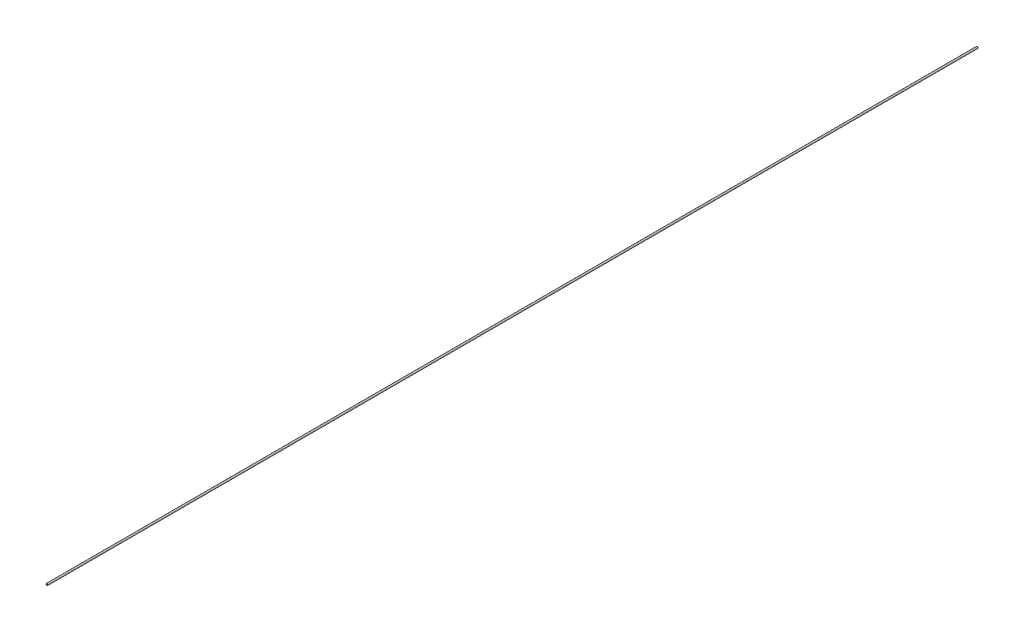
ISO-10303-21;
HEADER;
FILE_DESCRIPTION(('STEP AP214'),'2;1');
FILE_NAME('part.step','',(''),(''),'','','');
FILE_SCHEMA(('AUTOMOTIVE_DESIGN { 1 0 10303 214 1 1 1 1 }'));
ENDSEC;
DATA;
#1=APPLICATION_CONTEXT('core data for automotive mechanical design processes');
#2=APPLICATION_PROTOCOL_DEFINITION('international standard','automotive_design',2000,#1);
#3=PRODUCT_CONTEXT('',#1,'mechanical');
#4=PRODUCT('Part','Part','',(#3));
#5=PRODUCT_RELATED_PRODUCT_CATEGORY('part','',(#4));
#6=PRODUCT_DEFINITION_FORMATION('','',#4);
#7=PRODUCT_DEFINITION_CONTEXT('part definition',#1,'design');
#8=PRODUCT_DEFINITION('design','',#6,#7);
#9=PRODUCT_DEFINITION_SHAPE('','',#8);
#10=(LENGTH_UNIT() NAMED_UNIT(*) SI_UNIT(.MILLI.,.METRE.));
#11=(NAMED_UNIT(*) PLANE_ANGLE_UNIT() SI_UNIT($,.RADIAN.));
#12=(NAMED_UNIT(*) SI_UNIT($,.STERADIAN.) SOLID_ANGLE_UNIT());
#13=UNCERTAINTY_MEASURE_WITH_UNIT(LENGTH_MEASURE(1.E-05),#10,'distance_accuracy_value','');
#14=(GEOMETRIC_REPRESENTATION_CONTEXT(3) GLOBAL_UNCERTAINTY_ASSIGNED_CONTEXT((#13)) GLOBAL_UNIT_ASSIGNED_CONTEXT((#10,
#11,#12)) REPRESENTATION_CONTEXT('',''));
#15=CARTESIAN_POINT('',(0.,0.,0.));
#16=DIRECTION('',(0.,0.,1.));
#17=DIRECTION('',(1.,0.,0.));
#18=AXIS2_PLACEMENT_3D('',#15,#16,#17);
#19=CARTESIAN_POINT('',(0.,0.,6250.));
#20=DIRECTION('',(0.,0.,-1.));
#21=DIRECTION('',(-1.,0.,0.));
#22=AXIS2_PLACEMENT_3D('',#19,#20,#21);
#23=CYLINDRICAL_SURFACE('',#22,6.);
#24=CARTESIAN_POINT('',(0.,0.,1.99999999999978));
#25=DIRECTION('',(0.,0.,1.));
#26=DIRECTION('',(1.,0.,0.));
#27=AXIS2_PLACEMENT_3D('',#24,#25,#26);
#28=CIRCLE('',#27,6.);
#29=CARTESIAN_POINT('',(6.,0.,1.99999999999978));
#30=VERTEX_POINT('',#29);
#31=EDGE_CURVE('E43',#30,#30,#28,.T.);
#32=ORIENTED_EDGE('',*,*,#31,.T.);
#33=EDGE_LOOP('',(#32));
#34=FACE_BOUND('',#33,.T.);
#35=CARTESIAN_POINT('',(0.,0.,6248.));
#36=DIRECTION('',(0.,0.,1.));
#37=DIRECTION('',(1.,0.,0.));
#38=AXIS2_PLACEMENT_3D('',#35,#36,#37);
#39=CIRCLE('',#38,6.);
#40=CARTESIAN_POINT('',(6.,0.,6248.));
#41=VERTEX_POINT('',#40);
#42=EDGE_CURVE('E47',#41,#41,#39,.F.);
#43=ORIENTED_EDGE('',*,*,#42,.T.);
#44=EDGE_LOOP('',(#43));
#45=FACE_BOUND('',#44,.T.);
#46=ADVANCED_FACE('F32',(#34,#45),#23,.T.);
#47=CARTESIAN_POINT('',(0.,0.,6250.));
#48=DIRECTION('',(0.,0.,1.));
#49=DIRECTION('',(1.,0.,0.));
#50=AXIS2_PLACEMENT_3D('',#47,#48,#49);
#51=PLANE('',#50);
#52=CARTESIAN_POINT('',(0.,0.,6250.));
#53=DIRECTION('',(0.,0.,1.));
#54=DIRECTION('',(1.,0.,0.));
#55=AXIS2_PLACEMENT_3D('',#52,#53,#54);
#56=CIRCLE('',#55,4.);
#57=CARTESIAN_POINT('',(4.,0.,6250.));
#58=VERTEX_POINT('',#57);
#59=EDGE_CURVE('E10',#58,#58,#56,.T.);
#60=ORIENTED_EDGE('',*,*,#59,.T.);
#61=EDGE_LOOP('',(#60));
#62=FACE_BOUND('',#61,.T.);
#63=ADVANCED_FACE('F63',(#62),#51,.T.);
#64=CARTESIAN_POINT('',(0.,0.,0.));
#65=DIRECTION('',(0.,0.,1.));
#66=DIRECTION('',(1.,0.,0.));
#67=AXIS2_PLACEMENT_3D('',#64,#65,#66);
#68=PLANE('',#67);
#69=CARTESIAN_POINT('',(0.,0.,0.));
#70=DIRECTION('',(0.,0.,1.));
#71=DIRECTION('',(1.,0.,0.));
#72=AXIS2_PLACEMENT_3D('',#69,#70,#71);
#73=CIRCLE('',#72,4.);
#74=CARTESIAN_POINT('',(4.,0.,0.));
#75=VERTEX_POINT('',#74);
#76=EDGE_CURVE('E39',#75,#75,#73,.F.);
#77=ORIENTED_EDGE('',*,*,#76,.T.);
#78=EDGE_LOOP('',(#77));
#79=FACE_BOUND('',#78,.T.);
#80=ADVANCED_FACE('F60',(#79),#68,.F.);
#81=CARTESIAN_POINT('',(0.,0.,1.99999999999978));
#82=DIRECTION('',(0.,0.,1.));
#83=DIRECTION('',(1.,0.,0.));
#84=AXIS2_PLACEMENT_3D('',#81,#82,#83);
#85=TOROIDAL_SURFACE('',#84,4.,2.);
#86=ORIENTED_EDGE('',*,*,#76,.F.);
#87=EDGE_LOOP('',(#86));
#88=FACE_BOUND('',#87,.T.);
#89=ORIENTED_EDGE('',*,*,#31,.F.);
#90=EDGE_LOOP('',(#89));
#91=FACE_BOUND('',#90,.T.);
#92=ADVANCED_FACE('F56',(#88,#91),#85,.T.);
#93=CARTESIAN_POINT('',(0.,0.,6248.));
#94=DIRECTION('',(0.,0.,1.));
#95=DIRECTION('',(1.,0.,0.));
#96=AXIS2_PLACEMENT_3D('',#93,#94,#95);
#97=TOROIDAL_SURFACE('',#96,4.,2.);
#98=ORIENTED_EDGE('',*,*,#42,.F.);
#99=EDGE_LOOP('',(#98));
#100=FACE_BOUND('',#99,.T.);
#101=ORIENTED_EDGE('',*,*,#59,.F.);
#102=EDGE_LOOP('',(#101));
#103=FACE_BOUND('',#102,.T.);
#104=ADVANCED_FACE('F34',(#100,#103),#97,.T.);
#105=CLOSED_SHELL('',(#46,#63,#80,#92,#104));
#106=MANIFOLD_SOLID_BREP('B2',#105);
#107=ADVANCED_BREP_SHAPE_REPRESENTATION('',(#18,#106),#14);
#108=SHAPE_DEFINITION_REPRESENTATION(#9,#107);
ENDSEC;
END-ISO-10303-21;
